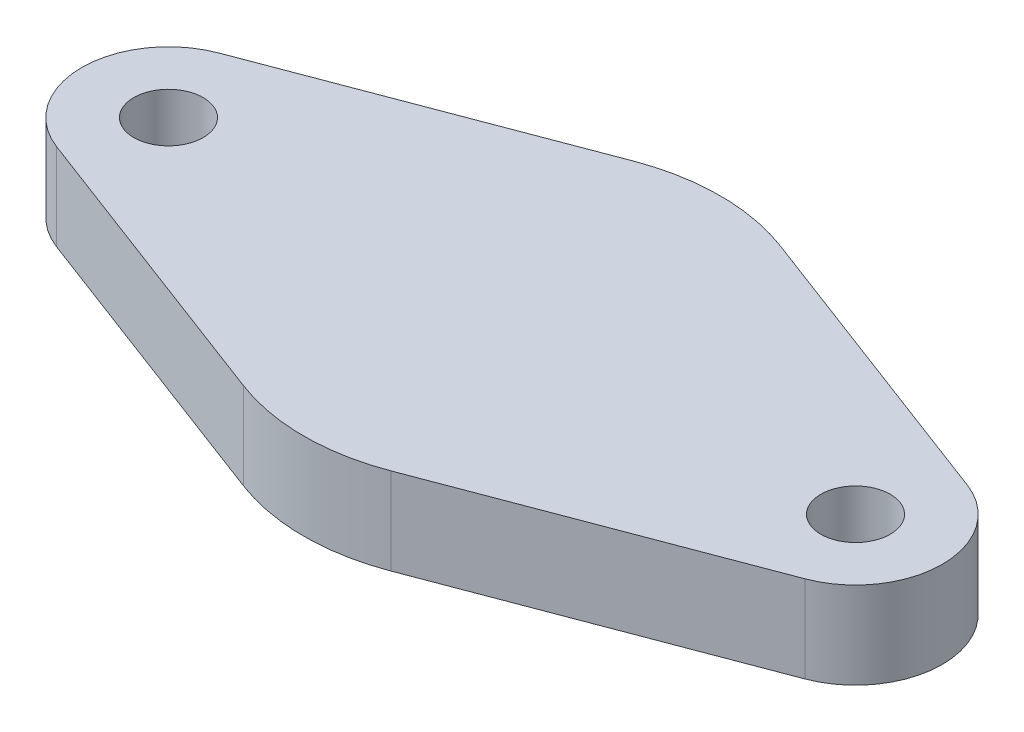
ISO-10303-21;
HEADER;
FILE_DESCRIPTION(('STEP AP214'),'2;1');
FILE_NAME('part.step','',(''),(''),'','','');
FILE_SCHEMA(('AUTOMOTIVE_DESIGN { 1 0 10303 214 1 1 1 1 }'));
ENDSEC;
DATA;
#1=APPLICATION_CONTEXT('core data for automotive mechanical design processes');
#2=APPLICATION_PROTOCOL_DEFINITION('international standard','automotive_design',2000,#1);
#3=PRODUCT_CONTEXT('',#1,'mechanical');
#4=PRODUCT('Part','Part','',(#3));
#5=PRODUCT_RELATED_PRODUCT_CATEGORY('part','',(#4));
#6=PRODUCT_DEFINITION_FORMATION('','',#4);
#7=PRODUCT_DEFINITION_CONTEXT('part definition',#1,'design');
#8=PRODUCT_DEFINITION('design','',#6,#7);
#9=PRODUCT_DEFINITION_SHAPE('','',#8);
#10=(LENGTH_UNIT() NAMED_UNIT(*) SI_UNIT(.MILLI.,.METRE.));
#11=(NAMED_UNIT(*) PLANE_ANGLE_UNIT() SI_UNIT($,.RADIAN.));
#12=(NAMED_UNIT(*) SI_UNIT($,.STERADIAN.) SOLID_ANGLE_UNIT());
#13=UNCERTAINTY_MEASURE_WITH_UNIT(LENGTH_MEASURE(1.E-05),#10,'distance_accuracy_value','');
#14=(GEOMETRIC_REPRESENTATION_CONTEXT(3) GLOBAL_UNCERTAINTY_ASSIGNED_CONTEXT((#13)) GLOBAL_UNIT_ASSIGNED_CONTEXT((#10,
#11,#12)) REPRESENTATION_CONTEXT('',''));
#15=CARTESIAN_POINT('',(0.,0.,0.));
#16=DIRECTION('',(0.,0.,1.));
#17=DIRECTION('',(1.,0.,0.));
#18=AXIS2_PLACEMENT_3D('',#15,#16,#17);
#19=CARTESIAN_POINT('',(0.,5.,0.));
#20=DIRECTION('',(0.,1.,0.));
#21=DIRECTION('',(0.,0.,1.));
#22=AXIS2_PLACEMENT_3D('',#19,#20,#21);
#23=PLANE('',#22);
#24=CARTESIAN_POINT('',(-19.8,5.,0.));
#25=DIRECTION('',(0.,1.,0.));
#26=DIRECTION('',(0.,0.,1.));
#27=AXIS2_PLACEMENT_3D('',#24,#25,#26);
#28=CIRCLE('',#27,2.);
#29=CARTESIAN_POINT('',(-19.8,5.,2.));
#30=VERTEX_POINT('',#29);
#31=EDGE_CURVE('E146',#30,#30,#28,.T.);
#32=ORIENTED_EDGE('',*,*,#31,.F.);
#33=EDGE_LOOP('',(#32));
#34=FACE_BOUND('',#33,.T.);
#35=CARTESIAN_POINT('',(0.,5.,0.));
#36=DIRECTION('',(0.,1.,0.));
#37=DIRECTION('',(0.,0.,1.));
#38=AXIS2_PLACEMENT_3D('',#35,#36,#37);
#39=CIRCLE('',#38,12.);
#40=CARTESIAN_POINT('',(4.24242424242425,5.,-11.225053966342));
#41=VERTEX_POINT('',#40);
#42=CARTESIAN_POINT('',(-4.24242424242425,5.,-11.225053966342));
#43=VERTEX_POINT('',#42);
#44=EDGE_CURVE('E164',#41,#43,#39,.T.);
#45=ORIENTED_EDGE('',*,*,#44,.T.);
#46=DIRECTION('',(-0.935421163861836,0.,0.353535353535354));
#47=VECTOR('',#46,1.);
#48=CARTESIAN_POINT('',(-21.5676767676768,5.,-4.67710581930918));
#49=LINE('',#48,#47);
#50=CARTESIAN_POINT('',(-21.5676767676768,5.,-4.67710581930918));
#51=VERTEX_POINT('',#50);
#52=EDGE_CURVE('E100',#43,#51,#49,.T.);
#53=ORIENTED_EDGE('',*,*,#52,.T.);
#54=CARTESIAN_POINT('',(-19.8,5.,0.));
#55=DIRECTION('',(0.,1.,0.));
#56=DIRECTION('',(0.,0.,1.));
#57=AXIS2_PLACEMENT_3D('',#54,#55,#56);
#58=CIRCLE('',#57,5.);
#59=CARTESIAN_POINT('',(-21.5676767676768,5.,4.67710581930919));
#60=VERTEX_POINT('',#59);
#61=EDGE_CURVE('E185',#51,#60,#58,.T.);
#62=ORIENTED_EDGE('',*,*,#61,.T.);
#63=DIRECTION('',(0.935421163861836,0.,0.353535353535354));
#64=VECTOR('',#63,1.);
#65=CARTESIAN_POINT('',(-21.5676767676768,5.,4.67710581930919));
#66=LINE('',#65,#64);
#67=CARTESIAN_POINT('',(-4.24242424242424,5.,11.225053966342));
#68=VERTEX_POINT('',#67);
#69=EDGE_CURVE('E199',#60,#68,#66,.T.);
#70=ORIENTED_EDGE('',*,*,#69,.T.);
#71=CARTESIAN_POINT('',(0.,5.,0.));
#72=DIRECTION('',(0.,1.,0.));
#73=DIRECTION('',(0.,0.,1.));
#74=AXIS2_PLACEMENT_3D('',#71,#72,#73);
#75=CIRCLE('',#74,12.);
#76=CARTESIAN_POINT('',(4.24242424242424,5.,11.225053966342));
#77=VERTEX_POINT('',#76);
#78=EDGE_CURVE('E119',#68,#77,#75,.T.);
#79=ORIENTED_EDGE('',*,*,#78,.T.);
#80=DIRECTION('',(0.935421163861836,0.,-0.353535353535354));
#81=VECTOR('',#80,1.);
#82=CARTESIAN_POINT('',(21.5676767676768,5.,4.67710581930919));
#83=LINE('',#82,#81);
#84=CARTESIAN_POINT('',(21.5676767676768,5.,4.67710581930919));
#85=VERTEX_POINT('',#84);
#86=EDGE_CURVE('E113',#77,#85,#83,.T.);
#87=ORIENTED_EDGE('',*,*,#86,.T.);
#88=CARTESIAN_POINT('',(19.8,5.,0.));
#89=DIRECTION('',(0.,1.,0.));
#90=DIRECTION('',(0.,0.,-1.));
#91=AXIS2_PLACEMENT_3D('',#88,#89,#90);
#92=CIRCLE('',#91,5.);
#93=CARTESIAN_POINT('',(21.5676767676768,5.,-4.67710581930918));
#94=VERTEX_POINT('',#93);
#95=EDGE_CURVE('E117',#85,#94,#92,.T.);
#96=ORIENTED_EDGE('',*,*,#95,.T.);
#97=DIRECTION('',(-0.935421163861836,0.,-0.353535353535354));
#98=VECTOR('',#97,1.);
#99=CARTESIAN_POINT('',(21.5676767676768,5.,-4.67710581930918));
#100=LINE('',#99,#98);
#101=EDGE_CURVE('E57',#94,#41,#100,.T.);
#102=ORIENTED_EDGE('',*,*,#101,.T.);
#103=EDGE_LOOP('',(#45,#53,#62,#70,#79,#87,#96,#102));
#104=FACE_BOUND('',#103,.T.);
#105=CARTESIAN_POINT('',(19.8,5.,0.));
#106=DIRECTION('',(0.,1.,0.));
#107=DIRECTION('',(0.,0.,-1.));
#108=AXIS2_PLACEMENT_3D('',#105,#106,#107);
#109=CIRCLE('',#108,2.);
#110=CARTESIAN_POINT('',(19.8,5.,-2.));
#111=VERTEX_POINT('',#110);
#112=EDGE_CURVE('E213',#111,#111,#109,.T.);
#113=ORIENTED_EDGE('',*,*,#112,.F.);
#114=EDGE_LOOP('',(#113));
#115=FACE_BOUND('',#114,.T.);
#116=ADVANCED_FACE('F39',(#34,#104,#115),#23,.T.);
#117=CARTESIAN_POINT('',(0.,0.,0.));
#118=DIRECTION('',(0.,1.,0.));
#119=DIRECTION('',(0.,0.,1.));
#120=AXIS2_PLACEMENT_3D('',#117,#118,#119);
#121=PLANE('',#120);
#122=CARTESIAN_POINT('',(0.,0.,0.));
#123=DIRECTION('',(0.,1.,0.));
#124=DIRECTION('',(0.,0.,1.));
#125=AXIS2_PLACEMENT_3D('',#122,#123,#124);
#126=CIRCLE('',#125,12.);
#127=CARTESIAN_POINT('',(4.24242424242425,0.,-11.225053966342));
#128=VERTEX_POINT('',#127);
#129=CARTESIAN_POINT('',(-4.24242424242425,0.,-11.225053966342));
#130=VERTEX_POINT('',#129);
#131=EDGE_CURVE('E141',#128,#130,#126,.T.);
#132=ORIENTED_EDGE('',*,*,#131,.F.);
#133=DIRECTION('',(-0.935421163861836,0.,-0.353535353535354));
#134=VECTOR('',#133,1.);
#135=CARTESIAN_POINT('',(21.5676767676768,0.,-4.67710581930918));
#136=LINE('',#135,#134);
#137=CARTESIAN_POINT('',(21.5676767676768,0.,-4.67710581930918));
#138=VERTEX_POINT('',#137);
#139=EDGE_CURVE('E92',#138,#128,#136,.T.);
#140=ORIENTED_EDGE('',*,*,#139,.F.);
#141=CARTESIAN_POINT('',(19.8,0.,0.));
#142=DIRECTION('',(0.,1.,0.));
#143=DIRECTION('',(0.,0.,-1.));
#144=AXIS2_PLACEMENT_3D('',#141,#142,#143);
#145=CIRCLE('',#144,5.);
#146=CARTESIAN_POINT('',(21.5676767676768,0.,4.67710581930919));
#147=VERTEX_POINT('',#146);
#148=EDGE_CURVE('E86',#147,#138,#145,.T.);
#149=ORIENTED_EDGE('',*,*,#148,.F.);
#150=DIRECTION('',(0.935421163861836,0.,-0.353535353535354));
#151=VECTOR('',#150,1.);
#152=CARTESIAN_POINT('',(21.5676767676768,0.,4.67710581930919));
#153=LINE('',#152,#151);
#154=CARTESIAN_POINT('',(4.24242424242424,0.,11.225053966342));
#155=VERTEX_POINT('',#154);
#156=EDGE_CURVE('E128',#155,#147,#153,.T.);
#157=ORIENTED_EDGE('',*,*,#156,.F.);
#158=CARTESIAN_POINT('',(0.,0.,0.));
#159=DIRECTION('',(0.,1.,0.));
#160=DIRECTION('',(0.,0.,1.));
#161=AXIS2_PLACEMENT_3D('',#158,#159,#160);
#162=CIRCLE('',#161,12.);
#163=CARTESIAN_POINT('',(-4.24242424242424,0.,11.225053966342));
#164=VERTEX_POINT('',#163);
#165=EDGE_CURVE('E155',#164,#155,#162,.T.);
#166=ORIENTED_EDGE('',*,*,#165,.F.);
#167=DIRECTION('',(0.935421163861836,0.,0.353535353535354));
#168=VECTOR('',#167,1.);
#169=CARTESIAN_POINT('',(-21.5676767676768,0.,4.67710581930919));
#170=LINE('',#169,#168);
#171=CARTESIAN_POINT('',(-21.5676767676768,0.,4.67710581930919));
#172=VERTEX_POINT('',#171);
#173=EDGE_CURVE('E152',#172,#164,#170,.T.);
#174=ORIENTED_EDGE('',*,*,#173,.F.);
#175=CARTESIAN_POINT('',(-19.8,0.,0.));
#176=DIRECTION('',(0.,1.,0.));
#177=DIRECTION('',(0.,0.,1.));
#178=AXIS2_PLACEMENT_3D('',#175,#176,#177);
#179=CIRCLE('',#178,5.);
#180=CARTESIAN_POINT('',(-21.5676767676768,0.,-4.67710581930918));
#181=VERTEX_POINT('',#180);
#182=EDGE_CURVE('E149',#181,#172,#179,.T.);
#183=ORIENTED_EDGE('',*,*,#182,.F.);
#184=DIRECTION('',(-0.935421163861836,0.,0.353535353535354));
#185=VECTOR('',#184,1.);
#186=CARTESIAN_POINT('',(-21.5676767676768,0.,-4.67710581930918));
#187=LINE('',#186,#185);
#188=EDGE_CURVE('E145',#130,#181,#187,.T.);
#189=ORIENTED_EDGE('',*,*,#188,.F.);
#190=EDGE_LOOP('',(#132,#140,#149,#157,#166,#174,#183,#189));
#191=FACE_BOUND('',#190,.T.);
#192=CARTESIAN_POINT('',(-19.8,0.,0.));
#193=DIRECTION('',(0.,1.,0.));
#194=DIRECTION('',(0.,0.,1.));
#195=AXIS2_PLACEMENT_3D('',#192,#193,#194);
#196=CIRCLE('',#195,2.);
#197=CARTESIAN_POINT('',(-19.8,0.,2.));
#198=VERTEX_POINT('',#197);
#199=EDGE_CURVE('E209',#198,#198,#196,.T.);
#200=ORIENTED_EDGE('',*,*,#199,.T.);
#201=EDGE_LOOP('',(#200));
#202=FACE_BOUND('',#201,.T.);
#203=CARTESIAN_POINT('',(19.8,0.,0.));
#204=DIRECTION('',(0.,1.,0.));
#205=DIRECTION('',(0.,0.,-1.));
#206=AXIS2_PLACEMENT_3D('',#203,#204,#205);
#207=CIRCLE('',#206,2.);
#208=CARTESIAN_POINT('',(19.8,0.,-2.));
#209=VERTEX_POINT('',#208);
#210=EDGE_CURVE('E217',#209,#209,#207,.T.);
#211=ORIENTED_EDGE('',*,*,#210,.T.);
#212=EDGE_LOOP('',(#211));
#213=FACE_BOUND('',#212,.T.);
#214=ADVANCED_FACE('F189',(#191,#202,#213),#121,.F.);
#215=CARTESIAN_POINT('',(0.,5.,0.));
#216=DIRECTION('',(0.,-1.,0.));
#217=DIRECTION('',(0.,0.,-1.));
#218=AXIS2_PLACEMENT_3D('',#215,#216,#217);
#219=CYLINDRICAL_SURFACE('',#218,12.);
#220=ORIENTED_EDGE('',*,*,#131,.T.);
#221=DIRECTION('',(0.,-1.,0.));
#222=VECTOR('',#221,1.);
#223=CARTESIAN_POINT('',(-4.24242424242425,5.,-11.225053966342));
#224=LINE('',#223,#222);
#225=EDGE_CURVE('E11',#43,#130,#224,.T.);
#226=ORIENTED_EDGE('',*,*,#225,.F.);
#227=ORIENTED_EDGE('',*,*,#44,.F.);
#228=DIRECTION('',(0.,-1.,0.));
#229=VECTOR('',#228,1.);
#230=CARTESIAN_POINT('',(4.24242424242425,5.,-11.225053966342));
#231=LINE('',#230,#229);
#232=EDGE_CURVE('E137',#41,#128,#231,.T.);
#233=ORIENTED_EDGE('',*,*,#232,.T.);
#234=EDGE_LOOP('',(#220,#226,#227,#233));
#235=FACE_BOUND('',#234,.T.);
#236=ADVANCED_FACE('F41',(#235),#219,.T.);
#237=CARTESIAN_POINT('',(-21.5676767676768,5.,-4.67710581930918));
#238=DIRECTION('',(0.353535353535354,0.,0.935421163861836));
#239=DIRECTION('',(0.935421163861836,0.,-0.353535353535354));
#240=AXIS2_PLACEMENT_3D('',#237,#238,#239);
#241=PLANE('',#240);
#242=ORIENTED_EDGE('',*,*,#188,.T.);
#243=DIRECTION('',(0.,-1.,0.));
#244=VECTOR('',#243,1.);
#245=CARTESIAN_POINT('',(-21.5676767676768,5.,-4.67710581930918));
#246=LINE('',#245,#244);
#247=EDGE_CURVE('E49',#51,#181,#246,.T.);
#248=ORIENTED_EDGE('',*,*,#247,.F.);
#249=ORIENTED_EDGE('',*,*,#52,.F.);
#250=ORIENTED_EDGE('',*,*,#225,.T.);
#251=EDGE_LOOP('',(#242,#248,#249,#250));
#252=FACE_BOUND('',#251,.T.);
#253=ADVANCED_FACE('F251',(#252),#241,.F.);
#254=CARTESIAN_POINT('',(-19.8,5.,0.));
#255=DIRECTION('',(0.,-1.,0.));
#256=DIRECTION('',(0.,0.,-1.));
#257=AXIS2_PLACEMENT_3D('',#254,#255,#256);
#258=CYLINDRICAL_SURFACE('',#257,5.);
#259=ORIENTED_EDGE('',*,*,#182,.T.);
#260=DIRECTION('',(0.,-1.,0.));
#261=VECTOR('',#260,1.);
#262=CARTESIAN_POINT('',(-21.5676767676768,5.,4.67710581930919));
#263=LINE('',#262,#261);
#264=EDGE_CURVE('E175',#60,#172,#263,.T.);
#265=ORIENTED_EDGE('',*,*,#264,.F.);
#266=ORIENTED_EDGE('',*,*,#61,.F.);
#267=ORIENTED_EDGE('',*,*,#247,.T.);
#268=EDGE_LOOP('',(#259,#265,#266,#267));
#269=FACE_BOUND('',#268,.T.);
#270=ADVANCED_FACE('F183',(#269),#258,.T.);
#271=CARTESIAN_POINT('',(-21.5676767676768,5.,4.67710581930919));
#272=DIRECTION('',(0.353535353535354,0.,-0.935421163861836));
#273=DIRECTION('',(-0.935421163861836,0.,-0.353535353535354));
#274=AXIS2_PLACEMENT_3D('',#271,#272,#273);
#275=PLANE('',#274);
#276=ORIENTED_EDGE('',*,*,#173,.T.);
#277=DIRECTION('',(0.,-1.,0.));
#278=VECTOR('',#277,1.);
#279=CARTESIAN_POINT('',(-4.24242424242424,5.,11.225053966342));
#280=LINE('',#279,#278);
#281=EDGE_CURVE('E171',#68,#164,#280,.T.);
#282=ORIENTED_EDGE('',*,*,#281,.F.);
#283=ORIENTED_EDGE('',*,*,#69,.F.);
#284=ORIENTED_EDGE('',*,*,#264,.T.);
#285=EDGE_LOOP('',(#276,#282,#283,#284));
#286=FACE_BOUND('',#285,.T.);
#287=ADVANCED_FACE('F194',(#286),#275,.F.);
#288=CARTESIAN_POINT('',(0.,5.,0.));
#289=DIRECTION('',(0.,-1.,0.));
#290=DIRECTION('',(0.,0.,-1.));
#291=AXIS2_PLACEMENT_3D('',#288,#289,#290);
#292=CYLINDRICAL_SURFACE('',#291,12.);
#293=ORIENTED_EDGE('',*,*,#165,.T.);
#294=DIRECTION('',(0.,-1.,0.));
#295=VECTOR('',#294,1.);
#296=CARTESIAN_POINT('',(4.24242424242424,5.,11.225053966342));
#297=LINE('',#296,#295);
#298=EDGE_CURVE('E130',#77,#155,#297,.T.);
#299=ORIENTED_EDGE('',*,*,#298,.F.);
#300=ORIENTED_EDGE('',*,*,#78,.F.);
#301=ORIENTED_EDGE('',*,*,#281,.T.);
#302=EDGE_LOOP('',(#293,#299,#300,#301));
#303=FACE_BOUND('',#302,.T.);
#304=ADVANCED_FACE('F197',(#303),#292,.T.);
#305=CARTESIAN_POINT('',(21.5676767676768,5.,4.67710581930919));
#306=DIRECTION('',(-0.353535353535354,0.,-0.935421163861836));
#307=DIRECTION('',(-0.935421163861836,0.,0.353535353535354));
#308=AXIS2_PLACEMENT_3D('',#305,#306,#307);
#309=PLANE('',#308);
#310=ORIENTED_EDGE('',*,*,#156,.T.);
#311=DIRECTION('',(0.,-1.,0.));
#312=VECTOR('',#311,1.);
#313=CARTESIAN_POINT('',(21.5676767676768,5.,4.67710581930919));
#314=LINE('',#313,#312);
#315=EDGE_CURVE('E125',#85,#147,#314,.T.);
#316=ORIENTED_EDGE('',*,*,#315,.F.);
#317=ORIENTED_EDGE('',*,*,#86,.F.);
#318=ORIENTED_EDGE('',*,*,#298,.T.);
#319=EDGE_LOOP('',(#310,#316,#317,#318));
#320=FACE_BOUND('',#319,.T.);
#321=ADVANCED_FACE('F126',(#320),#309,.F.);
#322=CARTESIAN_POINT('',(19.8,5.,0.));
#323=DIRECTION('',(0.,-1.,0.));
#324=DIRECTION('',(0.,0.,-1.));
#325=AXIS2_PLACEMENT_3D('',#322,#323,#324);
#326=CYLINDRICAL_SURFACE('',#325,5.);
#327=ORIENTED_EDGE('',*,*,#148,.T.);
#328=DIRECTION('',(0.,-1.,0.));
#329=VECTOR('',#328,1.);
#330=CARTESIAN_POINT('',(21.5676767676768,5.,-4.67710581930918));
#331=LINE('',#330,#329);
#332=EDGE_CURVE('E131',#94,#138,#331,.T.);
#333=ORIENTED_EDGE('',*,*,#332,.F.);
#334=ORIENTED_EDGE('',*,*,#95,.F.);
#335=ORIENTED_EDGE('',*,*,#315,.T.);
#336=EDGE_LOOP('',(#327,#333,#334,#335));
#337=FACE_BOUND('',#336,.T.);
#338=ADVANCED_FACE('F133',(#337),#326,.T.);
#339=CARTESIAN_POINT('',(21.5676767676768,5.,-4.67710581930918));
#340=DIRECTION('',(-0.353535353535354,0.,0.935421163861836));
#341=DIRECTION('',(0.935421163861836,0.,0.353535353535354));
#342=AXIS2_PLACEMENT_3D('',#339,#340,#341);
#343=PLANE('',#342);
#344=ORIENTED_EDGE('',*,*,#139,.T.);
#345=ORIENTED_EDGE('',*,*,#232,.F.);
#346=ORIENTED_EDGE('',*,*,#101,.F.);
#347=ORIENTED_EDGE('',*,*,#332,.T.);
#348=EDGE_LOOP('',(#344,#345,#346,#347));
#349=FACE_BOUND('',#348,.T.);
#350=ADVANCED_FACE('F239',(#349),#343,.F.);
#351=CARTESIAN_POINT('',(-19.8,5.,0.));
#352=DIRECTION('',(0.,-1.,0.));
#353=DIRECTION('',(0.,0.,-1.));
#354=AXIS2_PLACEMENT_3D('',#351,#352,#353);
#355=CYLINDRICAL_SURFACE('',#354,2.);
#356=ORIENTED_EDGE('',*,*,#31,.T.);
#357=EDGE_LOOP('',(#356));
#358=FACE_BOUND('',#357,.T.);
#359=ORIENTED_EDGE('',*,*,#199,.F.);
#360=EDGE_LOOP('',(#359));
#361=FACE_BOUND('',#360,.T.);
#362=ADVANCED_FACE('F236',(#358,#361),#355,.F.);
#363=CARTESIAN_POINT('',(19.8,5.,0.));
#364=DIRECTION('',(0.,-1.,0.));
#365=DIRECTION('',(0.,0.,-1.));
#366=AXIS2_PLACEMENT_3D('',#363,#364,#365);
#367=CYLINDRICAL_SURFACE('',#366,2.);
#368=ORIENTED_EDGE('',*,*,#112,.T.);
#369=EDGE_LOOP('',(#368));
#370=FACE_BOUND('',#369,.T.);
#371=ORIENTED_EDGE('',*,*,#210,.F.);
#372=EDGE_LOOP('',(#371));
#373=FACE_BOUND('',#372,.T.);
#374=ADVANCED_FACE('F225',(#370,#373),#367,.F.);
#375=CLOSED_SHELL('',(#116,#214,#236,#253,#270,#287,#304,#321,#338,#350,#362,#374));
#376=MANIFOLD_SOLID_BREP('B2',#375);
#377=ADVANCED_BREP_SHAPE_REPRESENTATION('',(#18,#376),#14);
#378=SHAPE_DEFINITION_REPRESENTATION(#9,#377);
ENDSEC;
END-ISO-10303-21;
